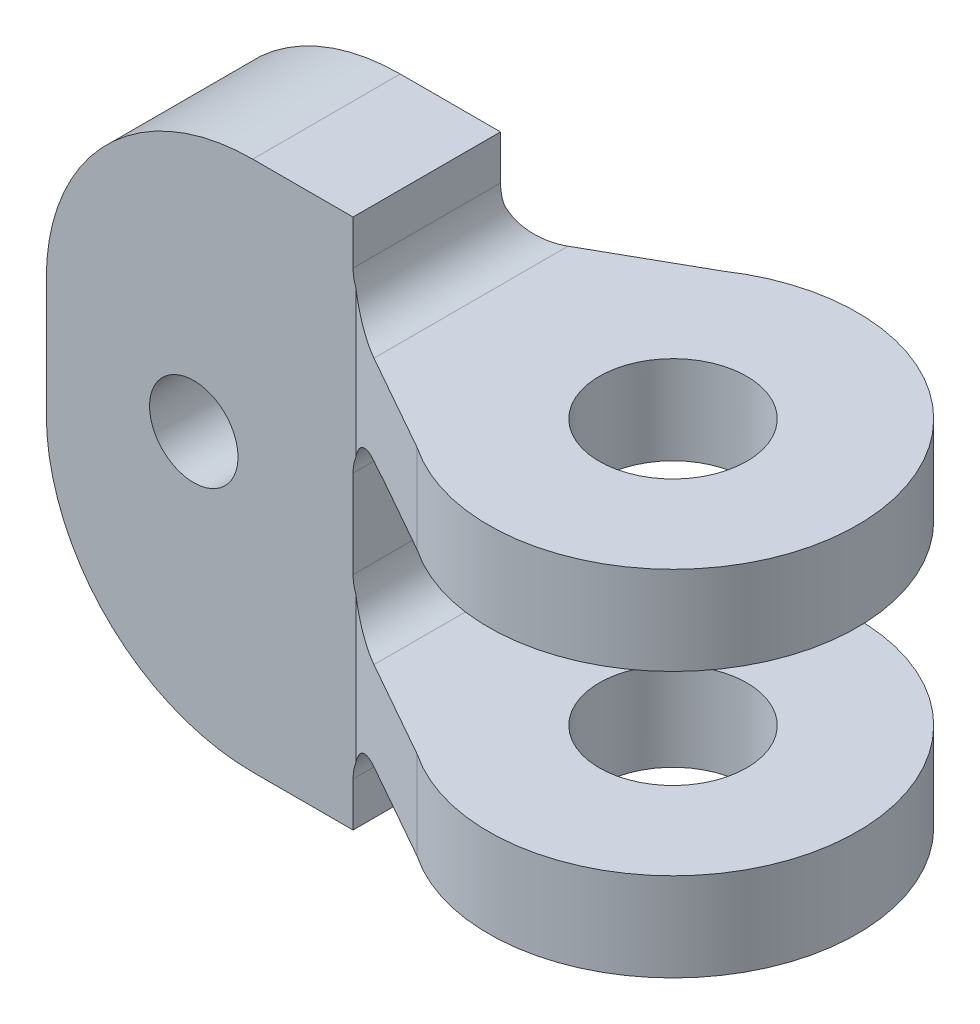
ISO-10303-21;
HEADER;
FILE_DESCRIPTION(('STEP AP214'),'2;1');
FILE_NAME('part.step','',(''),(''),'','','');
FILE_SCHEMA(('AUTOMOTIVE_DESIGN { 1 0 10303 214 1 1 1 1 }'));
ENDSEC;
DATA;
#1=APPLICATION_CONTEXT('core data for automotive mechanical design processes');
#2=APPLICATION_PROTOCOL_DEFINITION('international standard','automotive_design',2000,#1);
#3=PRODUCT_CONTEXT('',#1,'mechanical');
#4=PRODUCT('Part','Part','',(#3));
#5=PRODUCT_RELATED_PRODUCT_CATEGORY('part','',(#4));
#6=PRODUCT_DEFINITION_FORMATION('','',#4);
#7=PRODUCT_DEFINITION_CONTEXT('part definition',#1,'design');
#8=PRODUCT_DEFINITION('design','',#6,#7);
#9=PRODUCT_DEFINITION_SHAPE('','',#8);
#10=(LENGTH_UNIT() NAMED_UNIT(*) SI_UNIT(.MILLI.,.METRE.));
#11=(NAMED_UNIT(*) PLANE_ANGLE_UNIT() SI_UNIT($,.RADIAN.));
#12=(NAMED_UNIT(*) SI_UNIT($,.STERADIAN.) SOLID_ANGLE_UNIT());
#13=UNCERTAINTY_MEASURE_WITH_UNIT(LENGTH_MEASURE(1.E-05),#10,'distance_accuracy_value','');
#14=(GEOMETRIC_REPRESENTATION_CONTEXT(3) GLOBAL_UNCERTAINTY_ASSIGNED_CONTEXT((#13)) GLOBAL_UNIT_ASSIGNED_CONTEXT((#10,
#11,#12)) REPRESENTATION_CONTEXT('',''));
#15=CARTESIAN_POINT('',(0.,0.,0.));
#16=DIRECTION('',(0.,0.,1.));
#17=DIRECTION('',(1.,0.,0.));
#18=AXIS2_PLACEMENT_3D('',#15,#16,#17);
#19=CARTESIAN_POINT('',(4.37156478847927,-8.9,7.7513232231085));
#20=DIRECTION('',(0.4912379413343,0.,0.871025421554181));
#21=DIRECTION('',(0.871025421554181,0.,-0.4912379413343));
#22=AXIS2_PLACEMENT_3D('',#19,#20,#21);
#23=PLANE('',#22);
#24=DIRECTION('',(0.871025421554181,0.,-0.4912379413343));
#25=VECTOR('',#24,1.);
#26=CARTESIAN_POINT('',(15.9721292830665,2.1,1.20887649351865));
#27=LINE('',#26,#25);
#28=CARTESIAN_POINT('',(10.65,2.1,4.21043278318881));
#29=VERTEX_POINT('',#28);
#30=CARTESIAN_POINT('',(14.0073021214649,2.1,2.31699300316156));
#31=VERTEX_POINT('',#30);
#32=EDGE_CURVE('E277',#29,#31,#27,.T.);
#33=ORIENTED_EDGE('',*,*,#32,.F.);
#34=CARTESIAN_POINT('',(10.65,0.600000000000003,4.2104327831888));
#35=DIRECTION('',(0.4912379413343,0.,0.871025421554181));
#36=DIRECTION('',(0.871025421554181,0.,-0.4912379413343));
#37=AXIS2_PLACEMENT_3D('',#34,#35,#36);
#38=ELLIPSE('',#37,1.72210817604328,1.5);
#39=CARTESIAN_POINT('',(9.24999999999999,1.13851648071342,4.99999999999965));
#40=VERTEX_POINT('',#39);
#41=EDGE_CURVE('E340',#29,#40,#38,.T.);
#42=ORIENTED_EDGE('',*,*,#41,.T.);
#43=DIRECTION('',(0.,1.,0.));
#44=VECTOR('',#43,1.);
#45=CARTESIAN_POINT('',(9.24999999999999,-8.9,4.99999999999965));
#46=LINE('',#45,#44);
#47=CARTESIAN_POINT('',(9.24999999999999,6.06148351928657,4.99999999999965));
#48=VERTEX_POINT('',#47);
#49=EDGE_CURVE('E253',#40,#48,#46,.T.);
#50=ORIENTED_EDGE('',*,*,#49,.T.);
#51=CARTESIAN_POINT('',(10.65,6.6,4.2104327831888));
#52=DIRECTION('',(0.4912379413343,0.,0.871025421554181));
#53=DIRECTION('',(0.871025421554181,0.,-0.4912379413343));
#54=AXIS2_PLACEMENT_3D('',#51,#52,#53);
#55=ELLIPSE('',#54,1.72210817604328,1.5);
#56=CARTESIAN_POINT('',(10.65,5.1,4.21043278318881));
#57=VERTEX_POINT('',#56);
#58=EDGE_CURVE('E353',#48,#57,#55,.T.);
#59=ORIENTED_EDGE('',*,*,#58,.T.);
#60=DIRECTION('',(-0.871025421554181,0.,0.4912379413343));
#61=VECTOR('',#60,1.);
#62=CARTESIAN_POINT('',(15.9721292830665,5.1,1.20887649351865));
#63=LINE('',#62,#61);
#64=CARTESIAN_POINT('',(14.0073021214649,5.09999999999999,2.31699300316156));
#65=VERTEX_POINT('',#64);
#66=EDGE_CURVE('E274',#65,#57,#63,.T.);
#67=ORIENTED_EDGE('',*,*,#66,.F.);
#68=DIRECTION('',(0.,1.,0.));
#69=VECTOR('',#68,1.);
#70=CARTESIAN_POINT('',(14.0073021214649,-8.9,2.31699300316156));
#71=LINE('',#70,#69);
#72=EDGE_CURVE('E252',#31,#65,#71,.T.);
#73=ORIENTED_EDGE('',*,*,#72,.F.);
#74=EDGE_LOOP('',(#33,#42,#50,#59,#67,#73));
#75=FACE_BOUND('',#74,.T.);
#76=ADVANCED_FACE('F33',(#75),#23,.F.);
#77=CARTESIAN_POINT('',(-2.04664623553248,-8.9,3.62895605179609));
#78=DIRECTION('',(-0.4912379413343,0.,0.871025421554181));
#79=DIRECTION('',(0.871025421554181,0.,0.4912379413343));
#80=AXIS2_PLACEMENT_3D('',#77,#78,#79);
#81=PLANE('',#80);
#82=DIRECTION('',(0.,1.,0.));
#83=VECTOR('',#82,1.);
#84=CARTESIAN_POINT('',(9.24999999999999,-8.9,10.0000000000004));
#85=LINE('',#84,#83);
#86=CARTESIAN_POINT('',(9.24999999999999,1.13851648071342,10.0000000000004));
#87=VERTEX_POINT('',#86);
#88=CARTESIAN_POINT('',(9.24999999999999,6.06148351928657,10.0000000000004));
#89=VERTEX_POINT('',#88);
#90=EDGE_CURVE('E227',#87,#89,#85,.T.);
#91=ORIENTED_EDGE('',*,*,#90,.F.);
#92=CARTESIAN_POINT('',(10.65,0.600000000000003,10.7895672168112));
#93=DIRECTION('',(-0.4912379413343,0.,0.871025421554181));
#94=DIRECTION('',(-0.871025421554181,0.,-0.4912379413343));
#95=AXIS2_PLACEMENT_3D('',#92,#93,#94);
#96=ELLIPSE('',#95,1.72210817604328,1.5);
#97=CARTESIAN_POINT('',(10.65,2.1,10.7895672168112));
#98=VERTEX_POINT('',#97);
#99=EDGE_CURVE('E338',#87,#98,#96,.F.);
#100=ORIENTED_EDGE('',*,*,#99,.T.);
#101=DIRECTION('',(0.871025421554181,0.,0.4912379413343));
#102=VECTOR('',#101,1.);
#103=CARTESIAN_POINT('',(22.3903403070782,2.1,17.4108442315768));
#104=LINE('',#103,#102);
#105=CARTESIAN_POINT('',(14.0073021214649,2.1,12.6830069968384));
#106=VERTEX_POINT('',#105);
#107=EDGE_CURVE('E244',#98,#106,#104,.T.);
#108=ORIENTED_EDGE('',*,*,#107,.T.);
#109=DIRECTION('',(0.,1.,0.));
#110=VECTOR('',#109,1.);
#111=CARTESIAN_POINT('',(14.0073021214649,-8.9,12.6830069968384));
#112=LINE('',#111,#110);
#113=CARTESIAN_POINT('',(14.0073021214649,5.1,12.6830069968384));
#114=VERTEX_POINT('',#113);
#115=EDGE_CURVE('E224',#106,#114,#112,.T.);
#116=ORIENTED_EDGE('',*,*,#115,.T.);
#117=DIRECTION('',(-0.871025421554181,0.,-0.4912379413343));
#118=VECTOR('',#117,1.);
#119=CARTESIAN_POINT('',(22.3903403070782,5.1,17.4108442315768));
#120=LINE('',#119,#118);
#121=CARTESIAN_POINT('',(10.65,5.1,10.7895672168112));
#122=VERTEX_POINT('',#121);
#123=EDGE_CURVE('E241',#114,#122,#120,.T.);
#124=ORIENTED_EDGE('',*,*,#123,.T.);
#125=CARTESIAN_POINT('',(10.65,6.6,10.7895672168112));
#126=DIRECTION('',(-0.4912379413343,0.,0.871025421554181));
#127=DIRECTION('',(-0.871025421554181,0.,-0.4912379413343));
#128=AXIS2_PLACEMENT_3D('',#125,#126,#127);
#129=ELLIPSE('',#128,1.72210817604328,1.5);
#130=EDGE_CURVE('E345',#122,#89,#129,.F.);
#131=ORIENTED_EDGE('',*,*,#130,.T.);
#132=EDGE_LOOP('',(#91,#100,#108,#116,#124,#131));
#133=FACE_BOUND('',#132,.T.);
#134=ADVANCED_FACE('F422',(#133),#81,.T.);
#135=CARTESIAN_POINT('',(23.75,2.1,15.));
#136=DIRECTION('',(0.,1.,0.));
#137=DIRECTION('',(-1.,0.,0.));
#138=AXIS2_PLACEMENT_3D('',#135,#136,#137);
#139=PLANE('',#138);
#140=CARTESIAN_POINT('',(17.5,2.1,7.5));
#141=DIRECTION('',(0.,1.,0.));
#142=DIRECTION('',(-1.,0.,0.));
#143=AXIS2_PLACEMENT_3D('',#140,#141,#142);
#144=CIRCLE('',#143,2.5);
#145=CARTESIAN_POINT('',(15.,2.1,7.5));
#146=VERTEX_POINT('',#145);
#147=EDGE_CURVE('E295',#146,#146,#144,.F.);
#148=ORIENTED_EDGE('',*,*,#147,.F.);
#149=EDGE_LOOP('',(#148));
#150=FACE_BOUND('',#149,.T.);
#151=ORIENTED_EDGE('',*,*,#107,.F.);
#152=DIRECTION('',(0.,0.,1.));
#153=VECTOR('',#152,1.);
#154=CARTESIAN_POINT('',(10.65,2.1,4.99999999999965));
#155=LINE('',#154,#153);
#156=EDGE_CURVE('E319',#98,#29,#155,.F.);
#157=ORIENTED_EDGE('',*,*,#156,.T.);
#158=ORIENTED_EDGE('',*,*,#32,.T.);
#159=CARTESIAN_POINT('',(17.5,2.1,7.5));
#160=DIRECTION('',(0.,1.,0.));
#161=DIRECTION('',(-1.,0.,0.));
#162=AXIS2_PLACEMENT_3D('',#159,#160,#161);
#163=CIRCLE('',#162,6.25);
#164=EDGE_CURVE('E285',#106,#31,#163,.T.);
#165=ORIENTED_EDGE('',*,*,#164,.F.);
#166=EDGE_LOOP('',(#151,#157,#158,#165));
#167=FACE_BOUND('',#166,.T.);
#168=ADVANCED_FACE('F462',(#150,#167),#139,.F.);
#169=CARTESIAN_POINT('',(23.75,5.1,15.));
#170=DIRECTION('',(0.,-1.,0.));
#171=DIRECTION('',(1.,0.,0.));
#172=AXIS2_PLACEMENT_3D('',#169,#170,#171);
#173=PLANE('',#172);
#174=CARTESIAN_POINT('',(17.5,5.1,7.5));
#175=DIRECTION('',(0.,-1.,0.));
#176=DIRECTION('',(1.,0.,0.));
#177=AXIS2_PLACEMENT_3D('',#174,#175,#176);
#178=CIRCLE('',#177,2.5);
#179=CARTESIAN_POINT('',(20.,5.1,7.5));
#180=VERTEX_POINT('',#179);
#181=EDGE_CURVE('E292',#180,#180,#178,.F.);
#182=ORIENTED_EDGE('',*,*,#181,.F.);
#183=EDGE_LOOP('',(#182));
#184=FACE_BOUND('',#183,.T.);
#185=ORIENTED_EDGE('',*,*,#66,.T.);
#186=DIRECTION('',(0.,0.,1.));
#187=VECTOR('',#186,1.);
#188=CARTESIAN_POINT('',(10.65,5.1,10.0000000000004));
#189=LINE('',#188,#187);
#190=EDGE_CURVE('E321',#57,#122,#189,.T.);
#191=ORIENTED_EDGE('',*,*,#190,.T.);
#192=ORIENTED_EDGE('',*,*,#123,.F.);
#193=CARTESIAN_POINT('',(17.5,5.1,7.5));
#194=DIRECTION('',(0.,-1.,0.));
#195=DIRECTION('',(1.,0.,0.));
#196=AXIS2_PLACEMENT_3D('',#193,#194,#195);
#197=CIRCLE('',#196,6.25);
#198=EDGE_CURVE('E283',#65,#114,#197,.T.);
#199=ORIENTED_EDGE('',*,*,#198,.F.);
#200=EDGE_LOOP('',(#185,#191,#192,#199));
#201=FACE_BOUND('',#200,.T.);
#202=ADVANCED_FACE('F450',(#184,#201),#173,.F.);
#203=CARTESIAN_POINT('',(11.25,11.1,15.));
#204=DIRECTION('',(0.,1.,0.));
#205=DIRECTION('',(0.,0.,1.));
#206=AXIS2_PLACEMENT_3D('',#203,#204,#205);
#207=PLANE('',#206);
#208=CARTESIAN_POINT('',(17.5,11.1,7.5));
#209=DIRECTION('',(0.,1.,0.));
#210=DIRECTION('',(0.,0.,1.));
#211=AXIS2_PLACEMENT_3D('',#208,#209,#210);
#212=CIRCLE('',#211,2.5);
#213=CARTESIAN_POINT('',(17.5,11.1,10.));
#214=VERTEX_POINT('',#213);
#215=EDGE_CURVE('E289',#214,#214,#212,.F.);
#216=ORIENTED_EDGE('',*,*,#215,.F.);
#217=EDGE_LOOP('',(#216));
#218=FACE_BOUND('',#217,.T.);
#219=DIRECTION('',(0.871025421554181,0.,0.4912379413343));
#220=VECTOR('',#219,1.);
#221=CARTESIAN_POINT('',(12.9067742446577,11.1,12.0623350449003));
#222=LINE('',#221,#220);
#223=CARTESIAN_POINT('',(11.25,11.1,11.127953166873));
#224=VERTEX_POINT('',#223);
#225=CARTESIAN_POINT('',(14.0073021214649,11.1,12.6830069968384));
#226=VERTEX_POINT('',#225);
#227=EDGE_CURVE('E238',#224,#226,#222,.T.);
#228=ORIENTED_EDGE('',*,*,#227,.F.);
#229=DIRECTION('',(0.,0.,-1.));
#230=VECTOR('',#229,1.);
#231=CARTESIAN_POINT('',(11.25,11.1,15.));
#232=LINE('',#231,#230);
#233=CARTESIAN_POINT('',(11.25,11.1,3.87204683312702));
#234=VERTEX_POINT('',#233);
#235=EDGE_CURVE('E298',#224,#234,#232,.T.);
#236=ORIENTED_EDGE('',*,*,#235,.T.);
#237=DIRECTION('',(0.871025421554181,0.,-0.4912379413343));
#238=VECTOR('',#237,1.);
#239=CARTESIAN_POINT('',(6.48856322064596,11.1,6.5573856801951));
#240=LINE('',#239,#238);
#241=CARTESIAN_POINT('',(14.0073021214649,11.1,2.31699300316156));
#242=VERTEX_POINT('',#241);
#243=EDGE_CURVE('E271',#234,#242,#240,.T.);
#244=ORIENTED_EDGE('',*,*,#243,.T.);
#245=CARTESIAN_POINT('',(17.5,11.1,7.5));
#246=DIRECTION('',(0.,1.,0.));
#247=DIRECTION('',(0.,0.,1.));
#248=AXIS2_PLACEMENT_3D('',#245,#246,#247);
#249=CIRCLE('',#248,6.25);
#250=EDGE_CURVE('E281',#226,#242,#249,.T.);
#251=ORIENTED_EDGE('',*,*,#250,.F.);
#252=EDGE_LOOP('',(#228,#236,#244,#251));
#253=FACE_BOUND('',#252,.T.);
#254=ADVANCED_FACE('F448',(#218,#253),#207,.F.);
#255=CARTESIAN_POINT('',(23.75,14.1,15.));
#256=DIRECTION('',(0.,-1.,0.));
#257=DIRECTION('',(1.,0.,0.));
#258=AXIS2_PLACEMENT_3D('',#255,#256,#257);
#259=PLANE('',#258);
#260=CARTESIAN_POINT('',(17.5,14.1,7.5));
#261=DIRECTION('',(0.,-1.,0.));
#262=DIRECTION('',(1.,0.,0.));
#263=AXIS2_PLACEMENT_3D('',#260,#261,#262);
#264=CIRCLE('',#263,2.5);
#265=CARTESIAN_POINT('',(20.,14.1,7.5));
#266=VERTEX_POINT('',#265);
#267=EDGE_CURVE('E288',#266,#266,#264,.F.);
#268=ORIENTED_EDGE('',*,*,#267,.F.);
#269=EDGE_LOOP('',(#268));
#270=FACE_BOUND('',#269,.T.);
#271=DIRECTION('',(-0.871025421554181,0.,0.4912379413343));
#272=VECTOR('',#271,1.);
#273=CARTESIAN_POINT('',(15.9721292830665,14.1,1.20887649351865));
#274=LINE('',#273,#272);
#275=CARTESIAN_POINT('',(14.0073021214649,14.1,2.31699300316156));
#276=VERTEX_POINT('',#275);
#277=CARTESIAN_POINT('',(10.65,14.1,4.21043278318881));
#278=VERTEX_POINT('',#277);
#279=EDGE_CURVE('E266',#276,#278,#274,.T.);
#280=ORIENTED_EDGE('',*,*,#279,.T.);
#281=DIRECTION('',(0.,0.,1.));
#282=VECTOR('',#281,1.);
#283=CARTESIAN_POINT('',(10.65,14.1,10.0000000000004));
#284=LINE('',#283,#282);
#285=CARTESIAN_POINT('',(10.65,14.1,10.7895672168112));
#286=VERTEX_POINT('',#285);
#287=EDGE_CURVE('E331',#278,#286,#284,.T.);
#288=ORIENTED_EDGE('',*,*,#287,.T.);
#289=DIRECTION('',(-0.871025421554181,0.,-0.4912379413343));
#290=VECTOR('',#289,1.);
#291=CARTESIAN_POINT('',(22.3903403070782,14.1,17.4108442315768));
#292=LINE('',#291,#290);
#293=CARTESIAN_POINT('',(14.0073021214649,14.1,12.6830069968384));
#294=VERTEX_POINT('',#293);
#295=EDGE_CURVE('E233',#294,#286,#292,.T.);
#296=ORIENTED_EDGE('',*,*,#295,.F.);
#297=CARTESIAN_POINT('',(17.5,14.1,7.5));
#298=DIRECTION('',(0.,-1.,0.));
#299=DIRECTION('',(1.,0.,0.));
#300=AXIS2_PLACEMENT_3D('',#297,#298,#299);
#301=CIRCLE('',#300,6.25);
#302=EDGE_CURVE('E279',#276,#294,#301,.T.);
#303=ORIENTED_EDGE('',*,*,#302,.F.);
#304=EDGE_LOOP('',(#280,#288,#296,#303));
#305=FACE_BOUND('',#304,.T.);
#306=ADVANCED_FACE('F380',(#270,#305),#259,.F.);
#307=CARTESIAN_POINT('',(5.75000000000005,17.1,15.));
#308=DIRECTION('',(0.,-1.,0.));
#309=DIRECTION('',(0.,0.,-1.));
#310=AXIS2_PLACEMENT_3D('',#307,#308,#309);
#311=PLANE('',#310);
#312=DIRECTION('',(1.,0.,0.));
#313=VECTOR('',#312,1.);
#314=CARTESIAN_POINT('',(0.,17.1,10.0000000000004));
#315=LINE('',#314,#313);
#316=CARTESIAN_POINT('',(5.75,17.1,10.0000000000004));
#317=VERTEX_POINT('',#316);
#318=CARTESIAN_POINT('',(9.15,17.1,10.0000000000004));
#319=VERTEX_POINT('',#318);
#320=EDGE_CURVE('E393',#317,#319,#315,.T.);
#321=ORIENTED_EDGE('',*,*,#320,.T.);
#322=DIRECTION('',(0.,0.,-1.));
#323=VECTOR('',#322,1.);
#324=CARTESIAN_POINT('',(9.15,17.1,15.));
#325=LINE('',#324,#323);
#326=CARTESIAN_POINT('',(9.15,17.1,4.99999999999965));
#327=VERTEX_POINT('',#326);
#328=EDGE_CURVE('E397',#319,#327,#325,.T.);
#329=ORIENTED_EDGE('',*,*,#328,.T.);
#330=DIRECTION('',(1.,0.,0.));
#331=VECTOR('',#330,1.);
#332=CARTESIAN_POINT('',(0.,17.1,4.99999999999968));
#333=LINE('',#332,#331);
#334=CARTESIAN_POINT('',(5.75,17.1,4.99999999999966));
#335=VERTEX_POINT('',#334);
#336=EDGE_CURVE('E246',#335,#327,#333,.T.);
#337=ORIENTED_EDGE('',*,*,#336,.F.);
#338=DIRECTION('',(0.,0.,-1.));
#339=VECTOR('',#338,1.);
#340=CARTESIAN_POINT('',(5.75000000000005,17.1,15.));
#341=LINE('',#340,#339);
#342=EDGE_CURVE('E307',#317,#335,#341,.T.);
#343=ORIENTED_EDGE('',*,*,#342,.F.);
#344=EDGE_LOOP('',(#321,#329,#337,#343));
#345=FACE_BOUND('',#344,.T.);
#346=ADVANCED_FACE('F458',(#345),#311,.F.);
#347=CARTESIAN_POINT('',(5.75,10.1,15.));
#348=DIRECTION('',(0.,0.,-1.));
#349=DIRECTION('',(-1.,0.,0.));
#350=AXIS2_PLACEMENT_3D('',#347,#348,#349);
#351=CYLINDRICAL_SURFACE('',#350,7.);
#352=CARTESIAN_POINT('',(5.75,10.1,10.0000000000004));
#353=DIRECTION('',(0.,0.,1.));
#354=DIRECTION('',(1.,0.,0.));
#355=AXIS2_PLACEMENT_3D('',#352,#353,#354);
#356=CIRCLE('',#355,7.);
#357=CARTESIAN_POINT('',(-1.25,10.1,10.0000000000004));
#358=VERTEX_POINT('',#357);
#359=EDGE_CURVE('E231',#317,#358,#356,.T.);
#360=ORIENTED_EDGE('',*,*,#359,.F.);
#361=ORIENTED_EDGE('',*,*,#342,.T.);
#362=CARTESIAN_POINT('',(5.75,10.1,4.99999999999966));
#363=DIRECTION('',(0.,0.,1.));
#364=DIRECTION('',(1.,0.,0.));
#365=AXIS2_PLACEMENT_3D('',#362,#363,#364);
#366=CIRCLE('',#365,7.);
#367=CARTESIAN_POINT('',(-1.25,10.1,4.99999999999969));
#368=VERTEX_POINT('',#367);
#369=EDGE_CURVE('E263',#335,#368,#366,.T.);
#370=ORIENTED_EDGE('',*,*,#369,.T.);
#371=DIRECTION('',(0.,0.,-1.));
#372=VECTOR('',#371,1.);
#373=CARTESIAN_POINT('',(-1.25,10.1,15.));
#374=LINE('',#373,#372);
#375=EDGE_CURVE('E305',#358,#368,#374,.T.);
#376=ORIENTED_EDGE('',*,*,#375,.F.);
#377=EDGE_LOOP('',(#360,#361,#370,#376));
#378=FACE_BOUND('',#377,.T.);
#379=ADVANCED_FACE('F650',(#378),#351,.T.);
#380=CARTESIAN_POINT('',(-1.25,6.10000000000005,15.));
#381=DIRECTION('',(1.,0.,0.));
#382=DIRECTION('',(0.,0.,-1.));
#383=AXIS2_PLACEMENT_3D('',#380,#381,#382);
#384=PLANE('',#383);
#385=DIRECTION('',(0.,-1.,0.));
#386=VECTOR('',#385,1.);
#387=CARTESIAN_POINT('',(-1.25,6.10000000000005,10.0000000000004));
#388=LINE('',#387,#386);
#389=CARTESIAN_POINT('',(-1.25,6.10000000000005,10.0000000000004));
#390=VERTEX_POINT('',#389);
#391=EDGE_CURVE('E221',#358,#390,#388,.T.);
#392=ORIENTED_EDGE('',*,*,#391,.F.);
#393=ORIENTED_EDGE('',*,*,#375,.T.);
#394=DIRECTION('',(0.,-1.,0.));
#395=VECTOR('',#394,1.);
#396=CARTESIAN_POINT('',(-1.25,6.10000000000005,4.99999999999969));
#397=LINE('',#396,#395);
#398=CARTESIAN_POINT('',(-1.25,6.10000000000005,4.99999999999969));
#399=VERTEX_POINT('',#398);
#400=EDGE_CURVE('E260',#368,#399,#397,.T.);
#401=ORIENTED_EDGE('',*,*,#400,.T.);
#402=DIRECTION('',(0.,0.,-1.));
#403=VECTOR('',#402,1.);
#404=CARTESIAN_POINT('',(-1.25,6.10000000000005,15.));
#405=LINE('',#404,#403);
#406=EDGE_CURVE('E303',#390,#399,#405,.T.);
#407=ORIENTED_EDGE('',*,*,#406,.F.);
#408=EDGE_LOOP('',(#392,#393,#401,#407));
#409=FACE_BOUND('',#408,.T.);
#410=ADVANCED_FACE('F687',(#409),#384,.F.);
#411=CARTESIAN_POINT('',(5.75,6.1,15.));
#412=DIRECTION('',(0.,0.,-1.));
#413=DIRECTION('',(-1.,0.,0.));
#414=AXIS2_PLACEMENT_3D('',#411,#412,#413);
#415=CYLINDRICAL_SURFACE('',#414,7.);
#416=CARTESIAN_POINT('',(5.75,6.1,10.0000000000004));
#417=DIRECTION('',(0.,0.,1.));
#418=DIRECTION('',(1.,0.,0.));
#419=AXIS2_PLACEMENT_3D('',#416,#417,#418);
#420=CIRCLE('',#419,7.);
#421=CARTESIAN_POINT('',(5.75000000000005,-0.9,10.0000000000004));
#422=VERTEX_POINT('',#421);
#423=EDGE_CURVE('E218',#390,#422,#420,.T.);
#424=ORIENTED_EDGE('',*,*,#423,.F.);
#425=ORIENTED_EDGE('',*,*,#406,.T.);
#426=CARTESIAN_POINT('',(5.75,6.1,4.99999999999966));
#427=DIRECTION('',(0.,0.,1.));
#428=DIRECTION('',(1.,0.,0.));
#429=AXIS2_PLACEMENT_3D('',#426,#427,#428);
#430=CIRCLE('',#429,7.);
#431=CARTESIAN_POINT('',(5.75000000000005,-0.9,4.99999999999966));
#432=VERTEX_POINT('',#431);
#433=EDGE_CURVE('E256',#399,#432,#430,.T.);
#434=ORIENTED_EDGE('',*,*,#433,.T.);
#435=DIRECTION('',(0.,0.,-1.));
#436=VECTOR('',#435,1.);
#437=CARTESIAN_POINT('',(5.75000000000005,-0.9,15.));
#438=LINE('',#437,#436);
#439=EDGE_CURVE('E301',#422,#432,#438,.T.);
#440=ORIENTED_EDGE('',*,*,#439,.F.);
#441=EDGE_LOOP('',(#424,#425,#434,#440));
#442=FACE_BOUND('',#441,.T.);
#443=ADVANCED_FACE('F642',(#442),#415,.T.);
#444=CARTESIAN_POINT('',(5.75000000000005,-0.9,15.));
#445=DIRECTION('',(0.,1.,0.));
#446=DIRECTION('',(0.,0.,1.));
#447=AXIS2_PLACEMENT_3D('',#444,#445,#446);
#448=PLANE('',#447);
#449=DIRECTION('',(1.,0.,0.));
#450=VECTOR('',#449,1.);
#451=CARTESIAN_POINT('',(5.75000000000001,-0.9,4.99999999999966));
#452=LINE('',#451,#450);
#453=CARTESIAN_POINT('',(9.15,-0.9,4.99999999999965));
#454=VERTEX_POINT('',#453);
#455=EDGE_CURVE('E212',#432,#454,#452,.T.);
#456=ORIENTED_EDGE('',*,*,#455,.T.);
#457=DIRECTION('',(0.,0.,1.));
#458=VECTOR('',#457,1.);
#459=CARTESIAN_POINT('',(9.15,-0.9,15.));
#460=LINE('',#459,#458);
#461=CARTESIAN_POINT('',(9.15,-0.900000000000003,10.0000000000004));
#462=VERTEX_POINT('',#461);
#463=EDGE_CURVE('E198',#454,#462,#460,.T.);
#464=ORIENTED_EDGE('',*,*,#463,.T.);
#465=DIRECTION('',(1.,0.,0.));
#466=VECTOR('',#465,1.);
#467=CARTESIAN_POINT('',(5.75000000000005,-0.9,10.0000000000004));
#468=LINE('',#467,#466);
#469=EDGE_CURVE('E209',#422,#462,#468,.T.);
#470=ORIENTED_EDGE('',*,*,#469,.F.);
#471=ORIENTED_EDGE('',*,*,#439,.T.);
#472=EDGE_LOOP('',(#456,#464,#470,#471));
#473=FACE_BOUND('',#472,.T.);
#474=ADVANCED_FACE('F208',(#473),#448,.F.);
#475=CARTESIAN_POINT('',(11.25,11.1,15.));
#476=DIRECTION('',(-1.,0.,0.));
#477=DIRECTION('',(0.,-1.,0.));
#478=AXIS2_PLACEMENT_3D('',#475,#476,#477);
#479=PLANE('',#478);
#480=DIRECTION('',(0.,1.,0.));
#481=VECTOR('',#480,1.);
#482=CARTESIAN_POINT('',(11.25,11.1,11.127953166873));
#483=LINE('',#482,#481);
#484=CARTESIAN_POINT('',(11.25,11.0777472309389,11.127953166873));
#485=VERTEX_POINT('',#484);
#486=EDGE_CURVE('E236',#485,#224,#483,.T.);
#487=ORIENTED_EDGE('',*,*,#486,.F.);
#488=DIRECTION('',(0.,0.,-1.));
#489=VECTOR('',#488,1.);
#490=CARTESIAN_POINT('',(11.25,11.0777472309389,15.));
#491=LINE('',#490,#489);
#492=CARTESIAN_POINT('',(11.25,11.0777472309389,3.87204683312702));
#493=VERTEX_POINT('',#492);
#494=EDGE_CURVE('E406',#485,#493,#491,.T.);
#495=ORIENTED_EDGE('',*,*,#494,.T.);
#496=DIRECTION('',(0.,1.,0.));
#497=VECTOR('',#496,1.);
#498=CARTESIAN_POINT('',(11.25,11.1,3.87204683312702));
#499=LINE('',#498,#497);
#500=EDGE_CURVE('E269',#493,#234,#499,.T.);
#501=ORIENTED_EDGE('',*,*,#500,.T.);
#502=ORIENTED_EDGE('',*,*,#235,.F.);
#503=EDGE_LOOP('',(#487,#495,#501,#502));
#504=FACE_BOUND('',#503,.T.);
#505=ADVANCED_FACE('F444',(#504),#479,.F.);
#506=CARTESIAN_POINT('',(3.75,8.1,15.));
#507=DIRECTION('',(0.,0.,-1.));
#508=DIRECTION('',(-1.,0.,0.));
#509=AXIS2_PLACEMENT_3D('',#506,#507,#508);
#510=CYLINDRICAL_SURFACE('',#509,1.5);
#511=CARTESIAN_POINT('',(3.75,8.1,4.99999999999967));
#512=DIRECTION('',(0.,0.,1.));
#513=DIRECTION('',(1.,0.,0.));
#514=AXIS2_PLACEMENT_3D('',#511,#512,#513);
#515=CIRCLE('',#514,1.5);
#516=CARTESIAN_POINT('',(2.25,8.1,4.99999999999967));
#517=VERTEX_POINT('',#516);
#518=EDGE_CURVE('E257',#517,#517,#515,.T.);
#519=CARTESIAN_POINT('',(3.75,8.1,10.0000000000004));
#520=DIRECTION('',(0.,0.,1.));
#521=DIRECTION('',(1.,0.,0.));
#522=AXIS2_PLACEMENT_3D('',#519,#520,#521);
#523=CIRCLE('',#522,1.5);
#524=CARTESIAN_POINT('',(2.25,8.1,10.0000000000004));
#525=VERTEX_POINT('',#524);
#526=EDGE_CURVE('E219',#525,#525,#523,.T.);
#527=CARTESIAN_POINT('',(2.25,8.1,4.99999999999967));
#528=CARTESIAN_POINT('',(2.25,8.1,5.05208333333302));
#529=CARTESIAN_POINT('',(2.25,8.1,5.10416666666636));
#530=CARTESIAN_POINT('',(2.25,8.1,5.20833333333304));
#531=CARTESIAN_POINT('',(2.25,8.1,5.26041666666638));
#532=CARTESIAN_POINT('',(2.25,8.1,5.36458333333306));
#533=CARTESIAN_POINT('',(2.25,8.1,5.4166666666664));
#534=CARTESIAN_POINT('',(2.25,8.1,5.52083333333308));
#535=CARTESIAN_POINT('',(2.25,8.1,5.57291666666642));
#536=CARTESIAN_POINT('',(2.25,8.1,5.6770833333331));
#537=CARTESIAN_POINT('',(2.25,8.1,5.72916666666644));
#538=CARTESIAN_POINT('',(2.25,8.1,5.83333333333312));
#539=CARTESIAN_POINT('',(2.25,8.1,5.88541666666646));
#540=CARTESIAN_POINT('',(2.25,8.1,5.98958333333314));
#541=CARTESIAN_POINT('',(2.25,8.1,6.04166666666648));
#542=CARTESIAN_POINT('',(2.25,8.1,6.14583333333316));
#543=CARTESIAN_POINT('',(2.25,8.1,6.1979166666665));
#544=CARTESIAN_POINT('',(2.25,8.1,6.30208333333318));
#545=CARTESIAN_POINT('',(2.25,8.1,6.35416666666652));
#546=CARTESIAN_POINT('',(2.25,8.1,6.45833333333321));
#547=CARTESIAN_POINT('',(2.25,8.1,6.51041666666655));
#548=CARTESIAN_POINT('',(2.25,8.1,6.61458333333323));
#549=CARTESIAN_POINT('',(2.25,8.1,6.66666666666657));
#550=CARTESIAN_POINT('',(2.25,8.1,6.77083333333325));
#551=CARTESIAN_POINT('',(2.25,8.1,6.82291666666659));
#552=CARTESIAN_POINT('',(2.25,8.1,6.92708333333327));
#553=CARTESIAN_POINT('',(2.25,8.1,6.97916666666661));
#554=CARTESIAN_POINT('',(2.25,8.1,7.08333333333329));
#555=CARTESIAN_POINT('',(2.25,8.1,7.13541666666663));
#556=CARTESIAN_POINT('',(2.25,8.1,7.23958333333331));
#557=CARTESIAN_POINT('',(2.25,8.1,7.29166666666665));
#558=CARTESIAN_POINT('',(2.25,8.1,7.39583333333333));
#559=CARTESIAN_POINT('',(2.25,8.1,7.44791666666667));
#560=CARTESIAN_POINT('',(2.25,8.1,7.55208333333336));
#561=CARTESIAN_POINT('',(2.25,8.1,7.6041666666667));
#562=CARTESIAN_POINT('',(2.25,8.1,7.70833333333338));
#563=CARTESIAN_POINT('',(2.25,8.1,7.76041666666672));
#564=CARTESIAN_POINT('',(2.25,8.1,7.8645833333334));
#565=CARTESIAN_POINT('',(2.25,8.1,7.91666666666674));
#566=CARTESIAN_POINT('',(2.25,8.1,8.02083333333342));
#567=CARTESIAN_POINT('',(2.25,8.1,8.07291666666676));
#568=CARTESIAN_POINT('',(2.25,8.1,8.17708333333344));
#569=CARTESIAN_POINT('',(2.25,8.1,8.22916666666678));
#570=CARTESIAN_POINT('',(2.25,8.1,8.33333333333346));
#571=CARTESIAN_POINT('',(2.25,8.1,8.3854166666668));
#572=CARTESIAN_POINT('',(2.25,8.1,8.48958333333348));
#573=CARTESIAN_POINT('',(2.25,8.1,8.54166666666682));
#574=CARTESIAN_POINT('',(2.25,8.1,8.6458333333335));
#575=CARTESIAN_POINT('',(2.25,8.1,8.69791666666685));
#576=CARTESIAN_POINT('',(2.25,8.1,8.80208333333352));
#577=CARTESIAN_POINT('',(2.25,8.1,8.85416666666687));
#578=CARTESIAN_POINT('',(2.25,8.1,8.95833333333355));
#579=CARTESIAN_POINT('',(2.25,8.1,9.01041666666689));
#580=CARTESIAN_POINT('',(2.25,8.1,9.11458333333357));
#581=CARTESIAN_POINT('',(2.25,8.1,9.16666666666691));
#582=CARTESIAN_POINT('',(2.25,8.1,9.27083333333359));
#583=CARTESIAN_POINT('',(2.25,8.1,9.32291666666693));
#584=CARTESIAN_POINT('',(2.25,8.1,9.42708333333361));
#585=CARTESIAN_POINT('',(2.25,8.1,9.47916666666695));
#586=CARTESIAN_POINT('',(2.25,8.1,9.58333333333363));
#587=CARTESIAN_POINT('',(2.25,8.1,9.63541666666697));
#588=CARTESIAN_POINT('',(2.25,8.1,9.73958333333365));
#589=CARTESIAN_POINT('',(2.25,8.1,9.79166666666699));
#590=CARTESIAN_POINT('',(2.25,8.1,9.89583333333367));
#591=CARTESIAN_POINT('',(2.25,8.1,9.94791666666701));
#592=CARTESIAN_POINT('',(2.25,8.1,10.0000000000004));
#593=B_SPLINE_CURVE_WITH_KNOTS('',3,(#527,#528,#529,#530,#531,#532,#533,#534,#535,#536,#537,
#538,#539,#540,#541,#542,#543,#544,#545,#546,#547,#548,#549,#550,#551,#552,#553,#554,#555,#556,
#557,#558,#559,#560,#561,#562,#563,#564,#565,#566,#567,#568,#569,#570,#571,#572,#573,#574,#575,
#576,#577,#578,#579,#580,#581,#582,#583,#584,#585,#586,#587,#588,#589,#590,#591,#592),
.UNSPECIFIED.,.F.,.F.,(4,2,2,2,2,2,2,2,2,2,2,2,2,2,2,2,2,2,2,2,2,2,2,2,2,2,2,2,2,2,2,2,4),(0.,
0.156250000000021,0.312500000000042,0.468750000000063,0.625000000000086,0.781250000000106,
0.937500000000127,1.09375000000015,1.25000000000017,1.40625000000019,1.56250000000021,
1.71875000000023,1.87500000000025,2.03125000000028,2.1875000000003,2.34375000000032,
2.50000000000034,2.65625000000036,2.81250000000038,2.9687500000004,3.12500000000042,
3.28125000000045,3.43750000000047,3.59375000000049,3.75000000000051,3.90625000000053,
4.06250000000055,4.21875000000057,4.37500000000059,4.53125000000061,4.68750000000064,
4.84375000000066,5.00000000000068),.UNSPECIFIED.);
#594=EDGE_CURVE('BSEAM494',#517,#525,#593,.T.);
#595=ORIENTED_EDGE('',*,*,#518,.F.);
#596=ORIENTED_EDGE('',*,*,#526,.T.);
#597=ORIENTED_EDGE('',*,*,#594,.T.);
#598=ORIENTED_EDGE('',*,*,#594,.F.);
#599=EDGE_LOOP('',(#595,#597,#596,#598));
#600=FACE_BOUND('',#599,.T.);
#601=ADVANCED_FACE('F494',(#600),#510,.F.);
#602=CARTESIAN_POINT('',(17.5,20.,7.5));
#603=DIRECTION('',(0.,-1.,0.));
#604=DIRECTION('',(0.,0.,-1.));
#605=AXIS2_PLACEMENT_3D('',#602,#603,#604);
#606=CYLINDRICAL_SURFACE('',#605,2.5);
#607=ORIENTED_EDGE('',*,*,#267,.T.);
#608=EDGE_LOOP('',(#607));
#609=FACE_BOUND('',#608,.T.);
#610=ORIENTED_EDGE('',*,*,#215,.T.);
#611=EDGE_LOOP('',(#610));
#612=FACE_BOUND('',#611,.T.);
#613=ADVANCED_FACE('F492',(#609,#612),#606,.F.);
#614=ORIENTED_EDGE('',*,*,#181,.T.);
#615=EDGE_LOOP('',(#614));
#616=FACE_BOUND('',#615,.T.);
#617=ORIENTED_EDGE('',*,*,#147,.T.);
#618=EDGE_LOOP('',(#617));
#619=FACE_BOUND('',#618,.T.);
#620=ADVANCED_FACE('F487',(#616,#619),#606,.F.);
#621=CARTESIAN_POINT('',(17.5,20.,7.5));
#622=DIRECTION('',(0.,-1.,0.));
#623=DIRECTION('',(0.,0.,-1.));
#624=AXIS2_PLACEMENT_3D('',#621,#622,#623);
#625=CYLINDRICAL_SURFACE('',#624,6.25);
#626=ORIENTED_EDGE('',*,*,#164,.T.);
#627=ORIENTED_EDGE('',*,*,#72,.T.);
#628=ORIENTED_EDGE('',*,*,#198,.T.);
#629=ORIENTED_EDGE('',*,*,#115,.F.);
#630=EDGE_LOOP('',(#626,#627,#628,#629));
#631=FACE_BOUND('',#630,.T.);
#632=ADVANCED_FACE('F482',(#631),#625,.T.);
#633=ORIENTED_EDGE('',*,*,#250,.T.);
#634=EDGE_CURVE('E249',#242,#276,#71,.T.);
#635=ORIENTED_EDGE('',*,*,#634,.T.);
#636=ORIENTED_EDGE('',*,*,#302,.T.);
#637=EDGE_CURVE('E386',#226,#294,#112,.T.);
#638=ORIENTED_EDGE('',*,*,#637,.F.);
#639=EDGE_LOOP('',(#633,#635,#636,#638));
#640=FACE_BOUND('',#639,.T.);
#641=ADVANCED_FACE('F385',(#640),#625,.T.);
#642=ORIENTED_EDGE('',*,*,#500,.F.);
#643=DIRECTION('',(-0.871025421554181,0.,0.4912379413343));
#644=VECTOR('',#643,1.);
#645=CARTESIAN_POINT('',(4.37156478847927,11.0777472309389,7.7513232231085));
#646=LINE('',#645,#644);
#647=CARTESIAN_POINT('',(10.65,11.0777472309389,4.2104327831888));
#648=VERTEX_POINT('',#647);
#649=EDGE_CURVE('E403',#493,#648,#646,.T.);
#650=ORIENTED_EDGE('',*,*,#649,.T.);
#651=CARTESIAN_POINT('',(10.65,9.57774723093886,4.2104327831888));
#652=DIRECTION('',(0.4912379413343,0.,0.871025421554181));
#653=DIRECTION('',(0.871025421554181,0.,-0.4912379413343));
#654=AXIS2_PLACEMENT_3D('',#651,#652,#653);
#655=ELLIPSE('',#654,1.72210817604328,1.5);
#656=CARTESIAN_POINT('',(9.24999999999999,10.1162637116523,4.99999999999965));
#657=VERTEX_POINT('',#656);
#658=EDGE_CURVE('E359',#648,#657,#655,.T.);
#659=ORIENTED_EDGE('',*,*,#658,.T.);
#660=CARTESIAN_POINT('',(9.24999999999999,15.0614835192866,4.99999999999965));
#661=VERTEX_POINT('',#660);
#662=EDGE_CURVE('E47',#657,#661,#46,.T.);
#663=ORIENTED_EDGE('',*,*,#662,.T.);
#664=CARTESIAN_POINT('',(10.65,15.6,4.21043278318881));
#665=DIRECTION('',(0.4912379413343,0.,0.871025421554181));
#666=DIRECTION('',(0.871025421554181,0.,-0.4912379413343));
#667=AXIS2_PLACEMENT_3D('',#664,#665,#666);
#668=ELLIPSE('',#667,1.72210817604328,1.5);
#669=EDGE_CURVE('E11',#661,#278,#668,.T.);
#670=ORIENTED_EDGE('',*,*,#669,.T.);
#671=ORIENTED_EDGE('',*,*,#279,.F.);
#672=ORIENTED_EDGE('',*,*,#634,.F.);
#673=ORIENTED_EDGE('',*,*,#243,.F.);
#674=EDGE_LOOP('',(#642,#650,#659,#663,#670,#671,#672,#673));
#675=FACE_BOUND('',#674,.T.);
#676=ADVANCED_FACE('F377',(#675),#23,.F.);
#677=CARTESIAN_POINT('',(0.,-8.9,4.99999999999968));
#678=DIRECTION('',(0.,0.,1.));
#679=DIRECTION('',(1.,0.,0.));
#680=AXIS2_PLACEMENT_3D('',#677,#678,#679);
#681=PLANE('',#680);
#682=ORIENTED_EDGE('',*,*,#518,.T.);
#683=EDGE_LOOP('',(#682));
#684=FACE_BOUND('',#683,.T.);
#685=ORIENTED_EDGE('',*,*,#49,.F.);
#686=CARTESIAN_POINT('',(10.65,0.600000000000003,4.99999999999964));
#687=DIRECTION('',(0.,0.,1.));
#688=DIRECTION('',(1.,0.,0.));
#689=AXIS2_PLACEMENT_3D('',#686,#687,#688);
#690=CIRCLE('',#689,1.5);
#691=CARTESIAN_POINT('',(9.15,0.600000000000003,4.99999999999965));
#692=VERTEX_POINT('',#691);
#693=EDGE_CURVE('E343',#40,#692,#690,.T.);
#694=ORIENTED_EDGE('',*,*,#693,.T.);
#695=DIRECTION('',(0.,-1.,0.));
#696=VECTOR('',#695,1.);
#697=CARTESIAN_POINT('',(9.15,-8.9,4.99999999999965));
#698=LINE('',#697,#696);
#699=EDGE_CURVE('E213',#692,#454,#698,.T.);
#700=ORIENTED_EDGE('',*,*,#699,.T.);
#701=ORIENTED_EDGE('',*,*,#455,.F.);
#702=ORIENTED_EDGE('',*,*,#433,.F.);
#703=ORIENTED_EDGE('',*,*,#400,.F.);
#704=ORIENTED_EDGE('',*,*,#369,.F.);
#705=ORIENTED_EDGE('',*,*,#336,.T.);
#706=DIRECTION('',(0.,-1.,0.));
#707=VECTOR('',#706,1.);
#708=CARTESIAN_POINT('',(9.15,-8.9,4.99999999999965));
#709=LINE('',#708,#707);
#710=CARTESIAN_POINT('',(9.15,15.6,4.99999999999965));
#711=VERTEX_POINT('',#710);
#712=EDGE_CURVE('E371',#327,#711,#709,.T.);
#713=ORIENTED_EDGE('',*,*,#712,.T.);
#714=CARTESIAN_POINT('',(10.65,15.6,4.99999999999964));
#715=DIRECTION('',(0.,0.,1.));
#716=DIRECTION('',(1.,0.,0.));
#717=AXIS2_PLACEMENT_3D('',#714,#715,#716);
#718=CIRCLE('',#717,1.5);
#719=EDGE_CURVE('E41',#711,#661,#718,.T.);
#720=ORIENTED_EDGE('',*,*,#719,.T.);
#721=ORIENTED_EDGE('',*,*,#662,.F.);
#722=CARTESIAN_POINT('',(10.65,9.57774723093886,4.99999999999964));
#723=DIRECTION('',(0.,0.,1.));
#724=DIRECTION('',(1.,0.,0.));
#725=AXIS2_PLACEMENT_3D('',#722,#723,#724);
#726=CIRCLE('',#725,1.5);
#727=CARTESIAN_POINT('',(9.15,9.57774723093886,4.99999999999965));
#728=VERTEX_POINT('',#727);
#729=EDGE_CURVE('E361',#657,#728,#726,.T.);
#730=ORIENTED_EDGE('',*,*,#729,.T.);
#731=DIRECTION('',(0.,-1.,0.));
#732=VECTOR('',#731,1.);
#733=CARTESIAN_POINT('',(9.15,-8.9,4.99999999999965));
#734=LINE('',#733,#732);
#735=CARTESIAN_POINT('',(9.15,6.6,4.99999999999965));
#736=VERTEX_POINT('',#735);
#737=EDGE_CURVE('E400',#728,#736,#734,.T.);
#738=ORIENTED_EDGE('',*,*,#737,.T.);
#739=CARTESIAN_POINT('',(10.65,6.6,4.99999999999964));
#740=DIRECTION('',(0.,0.,1.));
#741=DIRECTION('',(1.,0.,0.));
#742=AXIS2_PLACEMENT_3D('',#739,#740,#741);
#743=CIRCLE('',#742,1.5);
#744=EDGE_CURVE('E350',#736,#48,#743,.T.);
#745=ORIENTED_EDGE('',*,*,#744,.T.);
#746=EDGE_LOOP('',(#685,#694,#700,#701,#702,#703,#704,#705,#713,#720,#721,#730,#738,#745));
#747=FACE_BOUND('',#746,.T.);
#748=ADVANCED_FACE('F370',(#684,#747),#681,.F.);
#749=DIRECTION('',(-0.871025421554181,0.,-0.4912379413343));
#750=VECTOR('',#749,1.);
#751=CARTESIAN_POINT('',(-2.04664623553248,11.0777472309389,3.62895605179609));
#752=LINE('',#751,#750);
#753=CARTESIAN_POINT('',(10.65,11.0777472309389,10.7895672168112));
#754=VERTEX_POINT('',#753);
#755=EDGE_CURVE('E409',#485,#754,#752,.T.);
#756=ORIENTED_EDGE('',*,*,#755,.F.);
#757=ORIENTED_EDGE('',*,*,#486,.T.);
#758=ORIENTED_EDGE('',*,*,#227,.T.);
#759=ORIENTED_EDGE('',*,*,#637,.T.);
#760=ORIENTED_EDGE('',*,*,#295,.T.);
#761=CARTESIAN_POINT('',(10.65,15.6,10.7895672168112));
#762=DIRECTION('',(-0.4912379413343,0.,0.871025421554181));
#763=DIRECTION('',(-0.871025421554181,0.,-0.4912379413343));
#764=AXIS2_PLACEMENT_3D('',#761,#762,#763);
#765=ELLIPSE('',#764,1.72210817604328,1.5);
#766=CARTESIAN_POINT('',(9.24999999999999,15.0614835192866,10.0000000000004));
#767=VERTEX_POINT('',#766);
#768=EDGE_CURVE('E363',#286,#767,#765,.F.);
#769=ORIENTED_EDGE('',*,*,#768,.T.);
#770=CARTESIAN_POINT('',(9.24999999999999,10.1162637116523,10.0000000000004));
#771=VERTEX_POINT('',#770);
#772=EDGE_CURVE('E55',#771,#767,#85,.T.);
#773=ORIENTED_EDGE('',*,*,#772,.F.);
#774=CARTESIAN_POINT('',(10.65,9.57774723093886,10.7895672168112));
#775=DIRECTION('',(-0.4912379413343,0.,0.871025421554181));
#776=DIRECTION('',(-0.871025421554181,0.,-0.4912379413343));
#777=AXIS2_PLACEMENT_3D('',#774,#775,#776);
#778=ELLIPSE('',#777,1.72210817604328,1.5);
#779=EDGE_CURVE('E357',#771,#754,#778,.F.);
#780=ORIENTED_EDGE('',*,*,#779,.T.);
#781=EDGE_LOOP('',(#756,#757,#758,#759,#760,#769,#773,#780));
#782=FACE_BOUND('',#781,.T.);
#783=ADVANCED_FACE('F389',(#782),#81,.T.);
#784=CARTESIAN_POINT('',(0.,-8.9,10.0000000000004));
#785=DIRECTION('',(0.,0.,1.));
#786=DIRECTION('',(1.,0.,0.));
#787=AXIS2_PLACEMENT_3D('',#784,#785,#786);
#788=PLANE('',#787);
#789=DIRECTION('',(0.,-1.,0.));
#790=VECTOR('',#789,1.);
#791=CARTESIAN_POINT('',(9.15,-8.9,10.0000000000004));
#792=LINE('',#791,#790);
#793=CARTESIAN_POINT('',(9.15,0.600000000000003,10.0000000000004));
#794=VERTEX_POINT('',#793);
#795=EDGE_CURVE('E194',#794,#462,#792,.T.);
#796=ORIENTED_EDGE('',*,*,#795,.F.);
#797=CARTESIAN_POINT('',(10.65,0.600000000000003,10.0000000000004));
#798=DIRECTION('',(0.,0.,1.));
#799=DIRECTION('',(1.,0.,0.));
#800=AXIS2_PLACEMENT_3D('',#797,#798,#799);
#801=CIRCLE('',#800,1.5);
#802=EDGE_CURVE('E336',#794,#87,#801,.F.);
#803=ORIENTED_EDGE('',*,*,#802,.T.);
#804=ORIENTED_EDGE('',*,*,#90,.T.);
#805=CARTESIAN_POINT('',(10.65,6.6,10.0000000000004));
#806=DIRECTION('',(0.,0.,1.));
#807=DIRECTION('',(1.,0.,0.));
#808=AXIS2_PLACEMENT_3D('',#805,#806,#807);
#809=CIRCLE('',#808,1.5);
#810=CARTESIAN_POINT('',(9.15,6.6,10.0000000000004));
#811=VERTEX_POINT('',#810);
#812=EDGE_CURVE('E348',#89,#811,#809,.F.);
#813=ORIENTED_EDGE('',*,*,#812,.T.);
#814=DIRECTION('',(0.,-1.,0.));
#815=VECTOR('',#814,1.);
#816=CARTESIAN_POINT('',(9.15,-8.9,10.0000000000004));
#817=LINE('',#816,#815);
#818=CARTESIAN_POINT('',(9.15,9.57774723093886,10.0000000000004));
#819=VERTEX_POINT('',#818);
#820=EDGE_CURVE('E204',#819,#811,#817,.T.);
#821=ORIENTED_EDGE('',*,*,#820,.F.);
#822=CARTESIAN_POINT('',(10.65,9.57774723093886,10.0000000000004));
#823=DIRECTION('',(0.,0.,1.));
#824=DIRECTION('',(1.,0.,0.));
#825=AXIS2_PLACEMENT_3D('',#822,#823,#824);
#826=CIRCLE('',#825,1.5);
#827=EDGE_CURVE('E355',#819,#771,#826,.F.);
#828=ORIENTED_EDGE('',*,*,#827,.T.);
#829=ORIENTED_EDGE('',*,*,#772,.T.);
#830=CARTESIAN_POINT('',(10.65,15.6,10.0000000000004));
#831=DIRECTION('',(0.,0.,1.));
#832=DIRECTION('',(1.,0.,0.));
#833=AXIS2_PLACEMENT_3D('',#830,#831,#832);
#834=CIRCLE('',#833,1.5);
#835=CARTESIAN_POINT('',(9.15,15.6,10.0000000000004));
#836=VERTEX_POINT('',#835);
#837=EDGE_CURVE('E365',#767,#836,#834,.F.);
#838=ORIENTED_EDGE('',*,*,#837,.T.);
#839=DIRECTION('',(0.,-1.,0.));
#840=VECTOR('',#839,1.);
#841=CARTESIAN_POINT('',(9.15,-8.9,10.0000000000004));
#842=LINE('',#841,#840);
#843=EDGE_CURVE('E309',#319,#836,#842,.T.);
#844=ORIENTED_EDGE('',*,*,#843,.F.);
#845=ORIENTED_EDGE('',*,*,#320,.F.);
#846=ORIENTED_EDGE('',*,*,#359,.T.);
#847=ORIENTED_EDGE('',*,*,#391,.T.);
#848=ORIENTED_EDGE('',*,*,#423,.T.);
#849=ORIENTED_EDGE('',*,*,#469,.T.);
#850=EDGE_LOOP('',(#796,#803,#804,#813,#821,#828,#829,#838,#844,#845,#846,#847,#848,#849));
#851=FACE_BOUND('',#850,.T.);
#852=ORIENTED_EDGE('',*,*,#526,.F.);
#853=EDGE_LOOP('',(#852));
#854=FACE_BOUND('',#853,.T.);
#855=ADVANCED_FACE('F215',(#851,#854),#788,.T.);
#856=CARTESIAN_POINT('',(9.15,14.1,3.53883589099269E-13));
#857=DIRECTION('',(-1.,0.,0.));
#858=DIRECTION('',(0.,0.,1.));
#859=AXIS2_PLACEMENT_3D('',#856,#857,#858);
#860=PLANE('',#859);
#861=ORIENTED_EDGE('',*,*,#843,.T.);
#862=DIRECTION('',(0.,0.,1.));
#863=VECTOR('',#862,1.);
#864=CARTESIAN_POINT('',(9.15,15.6,4.99999999999965));
#865=LINE('',#864,#863);
#866=EDGE_CURVE('E334',#836,#711,#865,.F.);
#867=ORIENTED_EDGE('',*,*,#866,.T.);
#868=ORIENTED_EDGE('',*,*,#712,.F.);
#869=ORIENTED_EDGE('',*,*,#328,.F.);
#870=EDGE_LOOP('',(#861,#867,#868,#869));
#871=FACE_BOUND('',#870,.T.);
#872=ADVANCED_FACE('F508',(#871),#860,.F.);
#873=CARTESIAN_POINT('',(9.15,5.1,3.53883589099269E-13));
#874=DIRECTION('',(-1.,0.,0.));
#875=DIRECTION('',(0.,0.,1.));
#876=AXIS2_PLACEMENT_3D('',#873,#874,#875);
#877=PLANE('',#876);
#878=ORIENTED_EDGE('',*,*,#820,.T.);
#879=DIRECTION('',(0.,0.,1.));
#880=VECTOR('',#879,1.);
#881=CARTESIAN_POINT('',(9.15,6.6,4.99999999999965));
#882=LINE('',#881,#880);
#883=EDGE_CURVE('E327',#811,#736,#882,.F.);
#884=ORIENTED_EDGE('',*,*,#883,.T.);
#885=ORIENTED_EDGE('',*,*,#737,.F.);
#886=DIRECTION('',(0.,0.,1.));
#887=VECTOR('',#886,1.);
#888=CARTESIAN_POINT('',(9.15,9.57774723093886,10.0000000000004));
#889=LINE('',#888,#887);
#890=EDGE_CURVE('E324',#728,#819,#889,.T.);
#891=ORIENTED_EDGE('',*,*,#890,.T.);
#892=EDGE_LOOP('',(#878,#884,#885,#891));
#893=FACE_BOUND('',#892,.T.);
#894=ADVANCED_FACE('F432',(#893),#877,.F.);
#895=CARTESIAN_POINT('',(13.4338802820812,11.0777472309389,3.53883589099269E-13));
#896=DIRECTION('',(0.,1.,0.));
#897=DIRECTION('',(0.,0.,1.));
#898=AXIS2_PLACEMENT_3D('',#895,#896,#897);
#899=PLANE('',#898);
#900=ORIENTED_EDGE('',*,*,#755,.T.);
#901=DIRECTION('',(0.,0.,1.));
#902=VECTOR('',#901,1.);
#903=CARTESIAN_POINT('',(10.65,11.0777472309389,4.99999999999965));
#904=LINE('',#903,#902);
#905=EDGE_CURVE('E329',#754,#648,#904,.F.);
#906=ORIENTED_EDGE('',*,*,#905,.T.);
#907=ORIENTED_EDGE('',*,*,#649,.F.);
#908=ORIENTED_EDGE('',*,*,#494,.F.);
#909=EDGE_LOOP('',(#900,#906,#907,#908));
#910=FACE_BOUND('',#909,.T.);
#911=ADVANCED_FACE('F442',(#910),#899,.F.);
#912=CARTESIAN_POINT('',(9.15,2.1,3.53883589099269E-13));
#913=DIRECTION('',(-1.,0.,0.));
#914=DIRECTION('',(0.,0.,1.));
#915=AXIS2_PLACEMENT_3D('',#912,#913,#914);
#916=PLANE('',#915);
#917=ORIENTED_EDGE('',*,*,#699,.F.);
#918=DIRECTION('',(0.,0.,1.));
#919=VECTOR('',#918,1.);
#920=CARTESIAN_POINT('',(9.15,0.600000000000003,10.0000000000004));
#921=LINE('',#920,#919);
#922=EDGE_CURVE('E201',#692,#794,#921,.T.);
#923=ORIENTED_EDGE('',*,*,#922,.T.);
#924=ORIENTED_EDGE('',*,*,#795,.T.);
#925=ORIENTED_EDGE('',*,*,#463,.F.);
#926=EDGE_LOOP('',(#917,#923,#924,#925));
#927=FACE_BOUND('',#926,.T.);
#928=ADVANCED_FACE('F197',(#927),#916,.F.);
#929=CARTESIAN_POINT('',(10.65,0.600000000000003,3.53883589099269E-13));
#930=DIRECTION('',(0.,0.,-1.));
#931=DIRECTION('',(-1.,0.,0.));
#932=AXIS2_PLACEMENT_3D('',#929,#930,#931);
#933=CYLINDRICAL_SURFACE('',#932,1.5);
#934=ORIENTED_EDGE('',*,*,#41,.F.);
#935=ORIENTED_EDGE('',*,*,#156,.F.);
#936=ORIENTED_EDGE('',*,*,#99,.F.);
#937=ORIENTED_EDGE('',*,*,#802,.F.);
#938=ORIENTED_EDGE('',*,*,#922,.F.);
#939=ORIENTED_EDGE('',*,*,#693,.F.);
#940=EDGE_LOOP('',(#934,#935,#936,#937,#938,#939));
#941=FACE_BOUND('',#940,.T.);
#942=ADVANCED_FACE('F416',(#941),#933,.F.);
#943=CARTESIAN_POINT('',(10.65,6.6,15.));
#944=DIRECTION('',(0.,0.,-1.));
#945=DIRECTION('',(-1.,0.,0.));
#946=AXIS2_PLACEMENT_3D('',#943,#944,#945);
#947=CYLINDRICAL_SURFACE('',#946,1.5);
#948=ORIENTED_EDGE('',*,*,#744,.F.);
#949=ORIENTED_EDGE('',*,*,#883,.F.);
#950=ORIENTED_EDGE('',*,*,#812,.F.);
#951=ORIENTED_EDGE('',*,*,#130,.F.);
#952=ORIENTED_EDGE('',*,*,#190,.F.);
#953=ORIENTED_EDGE('',*,*,#58,.F.);
#954=EDGE_LOOP('',(#948,#949,#950,#951,#952,#953));
#955=FACE_BOUND('',#954,.T.);
#956=ADVANCED_FACE('F428',(#955),#947,.F.);
#957=CARTESIAN_POINT('',(10.65,9.57774723093886,3.53883589099269E-13));
#958=DIRECTION('',(0.,0.,-1.));
#959=DIRECTION('',(-1.,0.,0.));
#960=AXIS2_PLACEMENT_3D('',#957,#958,#959);
#961=CYLINDRICAL_SURFACE('',#960,1.5);
#962=ORIENTED_EDGE('',*,*,#658,.F.);
#963=ORIENTED_EDGE('',*,*,#905,.F.);
#964=ORIENTED_EDGE('',*,*,#779,.F.);
#965=ORIENTED_EDGE('',*,*,#827,.F.);
#966=ORIENTED_EDGE('',*,*,#890,.F.);
#967=ORIENTED_EDGE('',*,*,#729,.F.);
#968=EDGE_LOOP('',(#962,#963,#964,#965,#966,#967));
#969=FACE_BOUND('',#968,.T.);
#970=ADVANCED_FACE('F437',(#969),#961,.F.);
#971=CARTESIAN_POINT('',(10.65,15.6,15.));
#972=DIRECTION('',(0.,0.,-1.));
#973=DIRECTION('',(-1.,0.,0.));
#974=AXIS2_PLACEMENT_3D('',#971,#972,#973);
#975=CYLINDRICAL_SURFACE('',#974,1.5);
#976=ORIENTED_EDGE('',*,*,#719,.F.);
#977=ORIENTED_EDGE('',*,*,#866,.F.);
#978=ORIENTED_EDGE('',*,*,#837,.F.);
#979=ORIENTED_EDGE('',*,*,#768,.F.);
#980=ORIENTED_EDGE('',*,*,#287,.F.);
#981=ORIENTED_EDGE('',*,*,#669,.F.);
#982=EDGE_LOOP('',(#976,#977,#978,#979,#980,#981));
#983=FACE_BOUND('',#982,.T.);
#984=ADVANCED_FACE('F35',(#983),#975,.F.);
#985=CLOSED_SHELL('',(#76,#134,#168,#202,#254,#306,#346,#379,#410,#443,#474,#505,#601,#613,#620,
#632,#641,#676,#748,#783,#855,#872,#894,#911,#928,#942,#956,#970,#984));
#986=MANIFOLD_SOLID_BREP('B2',#985);
#987=ADVANCED_BREP_SHAPE_REPRESENTATION('',(#18,#986),#14);
#988=SHAPE_DEFINITION_REPRESENTATION(#9,#987);
ENDSEC;
END-ISO-10303-21;
